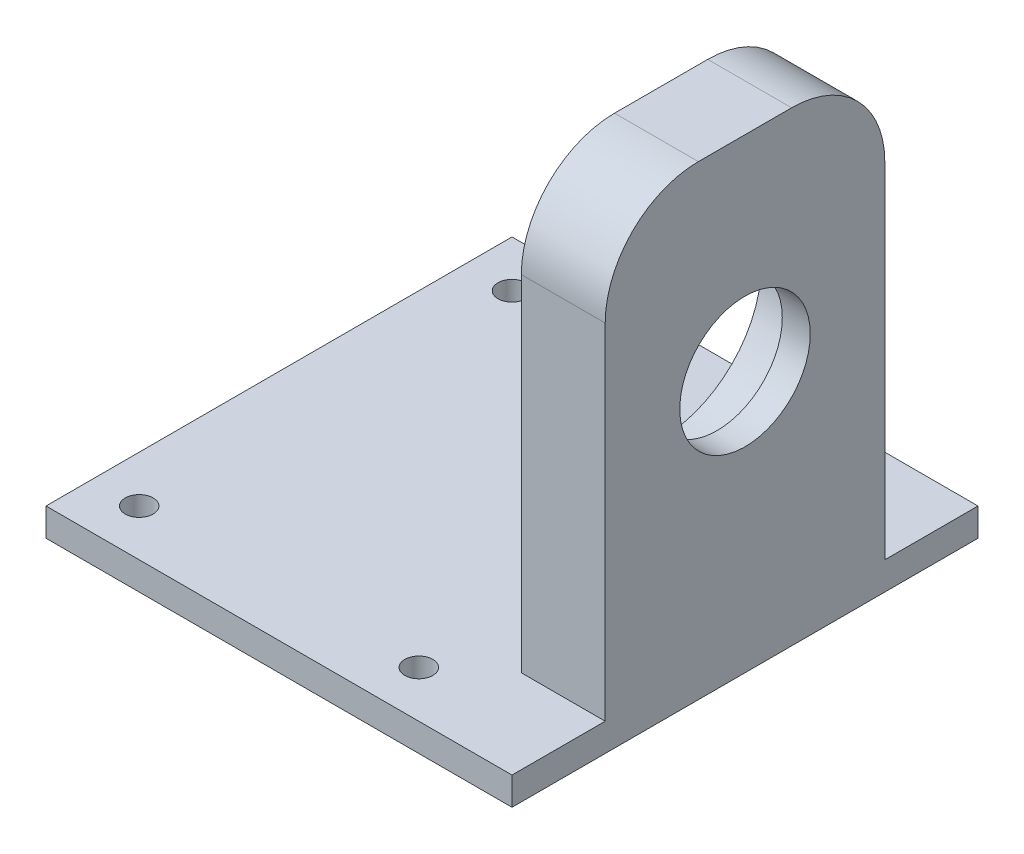
ISO-10303-21;
HEADER;
FILE_DESCRIPTION(('STEP AP214'),'2;1');
FILE_NAME('part.step','',(''),(''),'','','');
FILE_SCHEMA(('AUTOMOTIVE_DESIGN { 1 0 10303 214 1 1 1 1 }'));
ENDSEC;
DATA;
#1=APPLICATION_CONTEXT('core data for automotive mechanical design processes');
#2=APPLICATION_PROTOCOL_DEFINITION('international standard','automotive_design',2000,#1);
#3=PRODUCT_CONTEXT('',#1,'mechanical');
#4=PRODUCT('Part','Part','',(#3));
#5=PRODUCT_RELATED_PRODUCT_CATEGORY('part','',(#4));
#6=PRODUCT_DEFINITION_FORMATION('','',#4);
#7=PRODUCT_DEFINITION_CONTEXT('part definition',#1,'design');
#8=PRODUCT_DEFINITION('design','',#6,#7);
#9=PRODUCT_DEFINITION_SHAPE('','',#8);
#10=(LENGTH_UNIT() NAMED_UNIT(*) SI_UNIT(.MILLI.,.METRE.));
#11=(NAMED_UNIT(*) PLANE_ANGLE_UNIT() SI_UNIT($,.RADIAN.));
#12=(NAMED_UNIT(*) SI_UNIT($,.STERADIAN.) SOLID_ANGLE_UNIT());
#13=UNCERTAINTY_MEASURE_WITH_UNIT(LENGTH_MEASURE(1.E-05),#10,'distance_accuracy_value','');
#14=(GEOMETRIC_REPRESENTATION_CONTEXT(3) GLOBAL_UNCERTAINTY_ASSIGNED_CONTEXT((#13)) GLOBAL_UNIT_ASSIGNED_CONTEXT((#10,
#11,#12)) REPRESENTATION_CONTEXT('',''));
#15=CARTESIAN_POINT('',(0.,0.,0.));
#16=DIRECTION('',(0.,0.,1.));
#17=DIRECTION('',(1.,0.,0.));
#18=AXIS2_PLACEMENT_3D('',#15,#16,#17);
#19=CARTESIAN_POINT('',(0.,3.,0.));
#20=DIRECTION('',(0.,-1.,0.));
#21=DIRECTION('',(0.,0.,-1.));
#22=AXIS2_PLACEMENT_3D('',#19,#20,#21);
#23=PLANE('',#22);
#24=CARTESIAN_POINT('',(5.,3.,-45.));
#25=DIRECTION('',(0.,1.,0.));
#26=DIRECTION('',(0.,0.,1.));
#27=AXIS2_PLACEMENT_3D('',#24,#25,#26);
#28=CIRCLE('',#27,1.5);
#29=CARTESIAN_POINT('',(5.,3.,-43.5));
#30=VERTEX_POINT('',#29);
#31=EDGE_CURVE('E287',#30,#30,#28,.T.);
#32=ORIENTED_EDGE('',*,*,#31,.F.);
#33=EDGE_LOOP('',(#32));
#34=FACE_BOUND('',#33,.T.);
#35=CARTESIAN_POINT('',(5.,3.,-5.));
#36=DIRECTION('',(0.,1.,0.));
#37=DIRECTION('',(0.,0.,1.));
#38=AXIS2_PLACEMENT_3D('',#35,#36,#37);
#39=CIRCLE('',#38,1.5);
#40=CARTESIAN_POINT('',(5.,3.,-3.5));
#41=VERTEX_POINT('',#40);
#42=EDGE_CURVE('E299',#41,#41,#39,.T.);
#43=ORIENTED_EDGE('',*,*,#42,.F.);
#44=EDGE_LOOP('',(#43));
#45=FACE_BOUND('',#44,.T.);
#46=CARTESIAN_POINT('',(35.,3.,-5.));
#47=DIRECTION('',(0.,1.,0.));
#48=DIRECTION('',(0.,0.,1.));
#49=AXIS2_PLACEMENT_3D('',#46,#47,#48);
#50=CIRCLE('',#49,1.5);
#51=CARTESIAN_POINT('',(35.,3.,-3.49999999999999));
#52=VERTEX_POINT('',#51);
#53=EDGE_CURVE('E293',#52,#52,#50,.T.);
#54=ORIENTED_EDGE('',*,*,#53,.F.);
#55=EDGE_LOOP('',(#54));
#56=FACE_BOUND('',#55,.T.);
#57=CARTESIAN_POINT('',(35.,3.,-45.));
#58=DIRECTION('',(0.,1.,0.));
#59=DIRECTION('',(0.,0.,1.));
#60=AXIS2_PLACEMENT_3D('',#57,#58,#59);
#61=CIRCLE('',#60,1.5);
#62=CARTESIAN_POINT('',(35.,3.,-43.5));
#63=VERTEX_POINT('',#62);
#64=EDGE_CURVE('E283',#63,#63,#61,.T.);
#65=ORIENTED_EDGE('',*,*,#64,.F.);
#66=EDGE_LOOP('',(#65));
#67=FACE_BOUND('',#66,.T.);
#68=DIRECTION('',(1.,0.,0.));
#69=VECTOR('',#68,1.);
#70=CARTESIAN_POINT('',(41.,3.,-10.));
#71=LINE('',#70,#69);
#72=CARTESIAN_POINT('',(41.,3.,-10.));
#73=VERTEX_POINT('',#72);
#74=CARTESIAN_POINT('',(50.,3.,-10.));
#75=VERTEX_POINT('',#74);
#76=EDGE_CURVE('E124',#73,#75,#71,.T.);
#77=ORIENTED_EDGE('',*,*,#76,.F.);
#78=DIRECTION('',(0.,0.,1.));
#79=VECTOR('',#78,1.);
#80=CARTESIAN_POINT('',(41.,3.,-40.));
#81=LINE('',#80,#79);
#82=CARTESIAN_POINT('',(41.,3.,-40.));
#83=VERTEX_POINT('',#82);
#84=EDGE_CURVE('E110',#83,#73,#81,.T.);
#85=ORIENTED_EDGE('',*,*,#84,.F.);
#86=DIRECTION('',(-1.,0.,0.));
#87=VECTOR('',#86,1.);
#88=CARTESIAN_POINT('',(50.,3.,-40.));
#89=LINE('',#88,#87);
#90=CARTESIAN_POINT('',(50.,3.,-40.));
#91=VERTEX_POINT('',#90);
#92=EDGE_CURVE('E120',#91,#83,#89,.T.);
#93=ORIENTED_EDGE('',*,*,#92,.F.);
#94=DIRECTION('',(0.,0.,-1.));
#95=VECTOR('',#94,1.);
#96=CARTESIAN_POINT('',(50.,3.,0.));
#97=LINE('',#96,#95);
#98=CARTESIAN_POINT('',(50.,3.,-50.));
#99=VERTEX_POINT('',#98);
#100=EDGE_CURVE('E150',#91,#99,#97,.T.);
#101=ORIENTED_EDGE('',*,*,#100,.T.);
#102=DIRECTION('',(-1.,0.,0.));
#103=VECTOR('',#102,1.);
#104=CARTESIAN_POINT('',(0.,3.,-50.));
#105=LINE('',#104,#103);
#106=CARTESIAN_POINT('',(0.,3.,-50.));
#107=VERTEX_POINT('',#106);
#108=EDGE_CURVE('E153',#99,#107,#105,.T.);
#109=ORIENTED_EDGE('',*,*,#108,.T.);
#110=DIRECTION('',(0.,0.,1.));
#111=VECTOR('',#110,1.);
#112=CARTESIAN_POINT('',(0.,3.,0.));
#113=LINE('',#112,#111);
#114=CARTESIAN_POINT('',(0.,3.,0.));
#115=VERTEX_POINT('',#114);
#116=EDGE_CURVE('E144',#107,#115,#113,.T.);
#117=ORIENTED_EDGE('',*,*,#116,.T.);
#118=DIRECTION('',(1.,0.,0.));
#119=VECTOR('',#118,1.);
#120=CARTESIAN_POINT('',(0.,3.,0.));
#121=LINE('',#120,#119);
#122=CARTESIAN_POINT('',(50.,3.,0.));
#123=VERTEX_POINT('',#122);
#124=EDGE_CURVE('E147',#115,#123,#121,.T.);
#125=ORIENTED_EDGE('',*,*,#124,.T.);
#126=EDGE_CURVE('E151',#123,#75,#97,.T.);
#127=ORIENTED_EDGE('',*,*,#126,.T.);
#128=EDGE_LOOP('',(#77,#85,#93,#101,#109,#117,#125,#127));
#129=FACE_BOUND('',#128,.T.);
#130=ADVANCED_FACE('F32',(#34,#45,#56,#67,#129),#23,.F.);
#131=CARTESIAN_POINT('',(0.,3.,0.));
#132=DIRECTION('',(1.,0.,0.));
#133=DIRECTION('',(0.,0.,-1.));
#134=AXIS2_PLACEMENT_3D('',#131,#132,#133);
#135=PLANE('',#134);
#136=DIRECTION('',(0.,0.,1.));
#137=VECTOR('',#136,1.);
#138=CARTESIAN_POINT('',(0.,0.,0.));
#139=LINE('',#138,#137);
#140=CARTESIAN_POINT('',(0.,0.,-50.));
#141=VERTEX_POINT('',#140);
#142=CARTESIAN_POINT('',(0.,0.,0.));
#143=VERTEX_POINT('',#142);
#144=EDGE_CURVE('E143',#141,#143,#139,.T.);
#145=ORIENTED_EDGE('',*,*,#144,.T.);
#146=DIRECTION('',(0.,-1.,0.));
#147=VECTOR('',#146,1.);
#148=CARTESIAN_POINT('',(0.,3.,0.));
#149=LINE('',#148,#147);
#150=EDGE_CURVE('E171',#115,#143,#149,.T.);
#151=ORIENTED_EDGE('',*,*,#150,.F.);
#152=ORIENTED_EDGE('',*,*,#116,.F.);
#153=DIRECTION('',(0.,-1.,0.));
#154=VECTOR('',#153,1.);
#155=CARTESIAN_POINT('',(0.,3.,-50.));
#156=LINE('',#155,#154);
#157=EDGE_CURVE('E155',#107,#141,#156,.T.);
#158=ORIENTED_EDGE('',*,*,#157,.T.);
#159=EDGE_LOOP('',(#145,#151,#152,#158));
#160=FACE_BOUND('',#159,.T.);
#161=ADVANCED_FACE('F210',(#160),#135,.F.);
#162=CARTESIAN_POINT('',(0.,3.,0.));
#163=DIRECTION('',(0.,0.,-1.));
#164=DIRECTION('',(-1.,0.,0.));
#165=AXIS2_PLACEMENT_3D('',#162,#163,#164);
#166=PLANE('',#165);
#167=DIRECTION('',(1.,0.,0.));
#168=VECTOR('',#167,1.);
#169=CARTESIAN_POINT('',(0.,0.,0.));
#170=LINE('',#169,#168);
#171=CARTESIAN_POINT('',(50.,0.,0.));
#172=VERTEX_POINT('',#171);
#173=EDGE_CURVE('E158',#143,#172,#170,.T.);
#174=ORIENTED_EDGE('',*,*,#173,.T.);
#175=DIRECTION('',(0.,-1.,0.));
#176=VECTOR('',#175,1.);
#177=CARTESIAN_POINT('',(50.,3.,0.));
#178=LINE('',#177,#176);
#179=EDGE_CURVE('E168',#123,#172,#178,.T.);
#180=ORIENTED_EDGE('',*,*,#179,.F.);
#181=ORIENTED_EDGE('',*,*,#124,.F.);
#182=ORIENTED_EDGE('',*,*,#150,.T.);
#183=EDGE_LOOP('',(#174,#180,#181,#182));
#184=FACE_BOUND('',#183,.T.);
#185=ADVANCED_FACE('F216',(#184),#166,.F.);
#186=CARTESIAN_POINT('',(50.,3.,0.));
#187=DIRECTION('',(-1.,0.,0.));
#188=DIRECTION('',(0.,0.,1.));
#189=AXIS2_PLACEMENT_3D('',#186,#187,#188);
#190=PLANE('',#189);
#191=CARTESIAN_POINT('',(50.,28.,-25.));
#192=DIRECTION('',(1.,0.,0.));
#193=DIRECTION('',(0.,0.,-1.));
#194=AXIS2_PLACEMENT_3D('',#191,#192,#193);
#195=CIRCLE('',#194,7.);
#196=CARTESIAN_POINT('',(50.,28.,-32.));
#197=VERTEX_POINT('',#196);
#198=EDGE_CURVE('E128',#197,#197,#195,.T.);
#199=ORIENTED_EDGE('',*,*,#198,.F.);
#200=EDGE_LOOP('',(#199));
#201=FACE_BOUND('',#200,.T.);
#202=DIRECTION('',(0.,0.,-1.));
#203=VECTOR('',#202,1.);
#204=CARTESIAN_POINT('',(50.,50.,-40.));
#205=LINE('',#204,#203);
#206=CARTESIAN_POINT('',(50.,50.,-20.));
#207=VERTEX_POINT('',#206);
#208=CARTESIAN_POINT('',(50.,50.,-30.));
#209=VERTEX_POINT('',#208);
#210=EDGE_CURVE('E138',#207,#209,#205,.T.);
#211=ORIENTED_EDGE('',*,*,#210,.F.);
#212=CARTESIAN_POINT('',(50.,40.,-20.));
#213=DIRECTION('',(-1.,0.,0.));
#214=DIRECTION('',(0.,0.,1.));
#215=AXIS2_PLACEMENT_3D('',#212,#213,#214);
#216=CIRCLE('',#215,10.);
#217=CARTESIAN_POINT('',(50.,40.,-10.));
#218=VERTEX_POINT('',#217);
#219=EDGE_CURVE('E182',#207,#218,#216,.F.);
#220=ORIENTED_EDGE('',*,*,#219,.T.);
#221=DIRECTION('',(0.,-1.,0.));
#222=VECTOR('',#221,1.);
#223=CARTESIAN_POINT('',(50.,50.,-10.));
#224=LINE('',#223,#222);
#225=EDGE_CURVE('E139',#218,#75,#224,.T.);
#226=ORIENTED_EDGE('',*,*,#225,.T.);
#227=ORIENTED_EDGE('',*,*,#126,.F.);
#228=ORIENTED_EDGE('',*,*,#179,.T.);
#229=DIRECTION('',(0.,0.,-1.));
#230=VECTOR('',#229,1.);
#231=CARTESIAN_POINT('',(50.,0.,0.));
#232=LINE('',#231,#230);
#233=CARTESIAN_POINT('',(50.,0.,-50.));
#234=VERTEX_POINT('',#233);
#235=EDGE_CURVE('E160',#172,#234,#232,.T.);
#236=ORIENTED_EDGE('',*,*,#235,.T.);
#237=DIRECTION('',(0.,-1.,0.));
#238=VECTOR('',#237,1.);
#239=CARTESIAN_POINT('',(50.,3.,-50.));
#240=LINE('',#239,#238);
#241=EDGE_CURVE('E165',#99,#234,#240,.T.);
#242=ORIENTED_EDGE('',*,*,#241,.F.);
#243=ORIENTED_EDGE('',*,*,#100,.F.);
#244=DIRECTION('',(0.,-1.,0.));
#245=VECTOR('',#244,1.);
#246=CARTESIAN_POINT('',(50.,50.,-40.));
#247=LINE('',#246,#245);
#248=CARTESIAN_POINT('',(50.,40.,-40.));
#249=VERTEX_POINT('',#248);
#250=EDGE_CURVE('E114',#249,#91,#247,.T.);
#251=ORIENTED_EDGE('',*,*,#250,.F.);
#252=CARTESIAN_POINT('',(50.,40.,-30.));
#253=DIRECTION('',(-1.,0.,0.));
#254=DIRECTION('',(0.,0.,1.));
#255=AXIS2_PLACEMENT_3D('',#252,#253,#254);
#256=CIRCLE('',#255,10.);
#257=EDGE_CURVE('E180',#249,#209,#256,.F.);
#258=ORIENTED_EDGE('',*,*,#257,.T.);
#259=EDGE_LOOP('',(#211,#220,#226,#227,#228,#236,#242,#243,#251,#258));
#260=FACE_BOUND('',#259,.T.);
#261=ADVANCED_FACE('F196',(#201,#260),#190,.F.);
#262=CARTESIAN_POINT('',(0.,3.,-50.));
#263=DIRECTION('',(0.,0.,1.));
#264=DIRECTION('',(1.,0.,0.));
#265=AXIS2_PLACEMENT_3D('',#262,#263,#264);
#266=PLANE('',#265);
#267=DIRECTION('',(-1.,0.,0.));
#268=VECTOR('',#267,1.);
#269=CARTESIAN_POINT('',(0.,0.,-50.));
#270=LINE('',#269,#268);
#271=EDGE_CURVE('E148',#234,#141,#270,.T.);
#272=ORIENTED_EDGE('',*,*,#271,.T.);
#273=ORIENTED_EDGE('',*,*,#157,.F.);
#274=ORIENTED_EDGE('',*,*,#108,.F.);
#275=ORIENTED_EDGE('',*,*,#241,.T.);
#276=EDGE_LOOP('',(#272,#273,#274,#275));
#277=FACE_BOUND('',#276,.T.);
#278=ADVANCED_FACE('F226',(#277),#266,.F.);
#279=CARTESIAN_POINT('',(0.,0.,0.));
#280=DIRECTION('',(0.,-1.,0.));
#281=DIRECTION('',(0.,0.,-1.));
#282=AXIS2_PLACEMENT_3D('',#279,#280,#281);
#283=PLANE('',#282);
#284=CARTESIAN_POINT('',(5.,0.,-45.));
#285=DIRECTION('',(0.,-1.,0.));
#286=DIRECTION('',(0.,0.,-1.));
#287=AXIS2_PLACEMENT_3D('',#284,#285,#286);
#288=CIRCLE('',#287,1.5);
#289=CARTESIAN_POINT('',(5.,0.,-43.5));
#290=VERTEX_POINT('',#289);
#291=EDGE_CURVE('E302',#290,#290,#288,.F.);
#292=ORIENTED_EDGE('',*,*,#291,.T.);
#293=EDGE_LOOP('',(#292));
#294=FACE_BOUND('',#293,.T.);
#295=CARTESIAN_POINT('',(5.,0.,-5.));
#296=DIRECTION('',(0.,-1.,0.));
#297=DIRECTION('',(0.,0.,-1.));
#298=AXIS2_PLACEMENT_3D('',#295,#296,#297);
#299=CIRCLE('',#298,1.5);
#300=CARTESIAN_POINT('',(5.,0.,-3.5));
#301=VERTEX_POINT('',#300);
#302=EDGE_CURVE('E296',#301,#301,#299,.F.);
#303=ORIENTED_EDGE('',*,*,#302,.T.);
#304=EDGE_LOOP('',(#303));
#305=FACE_BOUND('',#304,.T.);
#306=CARTESIAN_POINT('',(35.,0.,-5.));
#307=DIRECTION('',(0.,-1.,0.));
#308=DIRECTION('',(0.,0.,-1.));
#309=AXIS2_PLACEMENT_3D('',#306,#307,#308);
#310=CIRCLE('',#309,1.5);
#311=CARTESIAN_POINT('',(35.,0.,-3.49999999999999));
#312=VERTEX_POINT('',#311);
#313=EDGE_CURVE('E290',#312,#312,#310,.F.);
#314=ORIENTED_EDGE('',*,*,#313,.T.);
#315=EDGE_LOOP('',(#314));
#316=FACE_BOUND('',#315,.T.);
#317=CARTESIAN_POINT('',(35.,0.,-45.));
#318=DIRECTION('',(0.,-1.,0.));
#319=DIRECTION('',(0.,0.,-1.));
#320=AXIS2_PLACEMENT_3D('',#317,#318,#319);
#321=CIRCLE('',#320,1.5);
#322=CARTESIAN_POINT('',(35.,0.,-43.5));
#323=VERTEX_POINT('',#322);
#324=EDGE_CURVE('E284',#323,#323,#321,.F.);
#325=ORIENTED_EDGE('',*,*,#324,.T.);
#326=EDGE_LOOP('',(#325));
#327=FACE_BOUND('',#326,.T.);
#328=ORIENTED_EDGE('',*,*,#144,.F.);
#329=ORIENTED_EDGE('',*,*,#271,.F.);
#330=ORIENTED_EDGE('',*,*,#235,.F.);
#331=ORIENTED_EDGE('',*,*,#173,.F.);
#332=EDGE_LOOP('',(#328,#329,#330,#331));
#333=FACE_BOUND('',#332,.T.);
#334=ADVANCED_FACE('F223',(#294,#305,#316,#327,#333),#283,.T.);
#335=CARTESIAN_POINT('',(50.,50.,-40.));
#336=DIRECTION('',(0.,0.,1.));
#337=DIRECTION('',(1.,0.,0.));
#338=AXIS2_PLACEMENT_3D('',#335,#336,#337);
#339=PLANE('',#338);
#340=DIRECTION('',(0.,-1.,0.));
#341=VECTOR('',#340,1.);
#342=CARTESIAN_POINT('',(41.,50.,-40.));
#343=LINE('',#342,#341);
#344=CARTESIAN_POINT('',(41.,40.,-40.));
#345=VERTEX_POINT('',#344);
#346=EDGE_CURVE('E107',#345,#83,#343,.T.);
#347=ORIENTED_EDGE('',*,*,#346,.F.);
#348=DIRECTION('',(-1.,0.,0.));
#349=VECTOR('',#348,1.);
#350=CARTESIAN_POINT('',(50.,40.,-40.));
#351=LINE('',#350,#349);
#352=EDGE_CURVE('E11',#345,#249,#351,.F.);
#353=ORIENTED_EDGE('',*,*,#352,.T.);
#354=ORIENTED_EDGE('',*,*,#250,.T.);
#355=ORIENTED_EDGE('',*,*,#92,.T.);
#356=EDGE_LOOP('',(#347,#353,#354,#355));
#357=FACE_BOUND('',#356,.T.);
#358=ADVANCED_FACE('F126',(#357),#339,.F.);
#359=CARTESIAN_POINT('',(41.,50.,-40.));
#360=DIRECTION('',(1.,0.,0.));
#361=DIRECTION('',(0.,0.,-1.));
#362=AXIS2_PLACEMENT_3D('',#359,#360,#361);
#363=PLANE('',#362);
#364=CARTESIAN_POINT('',(41.,28.,-25.));
#365=DIRECTION('',(1.,0.,0.));
#366=DIRECTION('',(0.,0.,-1.));
#367=AXIS2_PLACEMENT_3D('',#364,#365,#366);
#368=CIRCLE('',#367,10.75);
#369=CARTESIAN_POINT('',(41.,28.,-35.75));
#370=VERTEX_POINT('',#369);
#371=EDGE_CURVE('E265',#370,#370,#368,.F.);
#372=ORIENTED_EDGE('',*,*,#371,.F.);
#373=EDGE_LOOP('',(#372));
#374=FACE_BOUND('',#373,.T.);
#375=DIRECTION('',(0.,-1.,0.));
#376=VECTOR('',#375,1.);
#377=CARTESIAN_POINT('',(41.,50.,-10.));
#378=LINE('',#377,#376);
#379=CARTESIAN_POINT('',(41.,40.,-10.));
#380=VERTEX_POINT('',#379);
#381=EDGE_CURVE('E115',#380,#73,#378,.T.);
#382=ORIENTED_EDGE('',*,*,#381,.F.);
#383=CARTESIAN_POINT('',(41.,40.,-20.));
#384=DIRECTION('',(1.,0.,0.));
#385=DIRECTION('',(0.,0.,-1.));
#386=AXIS2_PLACEMENT_3D('',#383,#384,#385);
#387=CIRCLE('',#386,10.);
#388=CARTESIAN_POINT('',(41.,50.,-20.));
#389=VERTEX_POINT('',#388);
#390=EDGE_CURVE('E40',#380,#389,#387,.F.);
#391=ORIENTED_EDGE('',*,*,#390,.T.);
#392=DIRECTION('',(0.,0.,1.));
#393=VECTOR('',#392,1.);
#394=CARTESIAN_POINT('',(41.,50.,-40.));
#395=LINE('',#394,#393);
#396=CARTESIAN_POINT('',(41.,50.,-30.));
#397=VERTEX_POINT('',#396);
#398=EDGE_CURVE('E134',#397,#389,#395,.T.);
#399=ORIENTED_EDGE('',*,*,#398,.F.);
#400=CARTESIAN_POINT('',(41.,40.,-30.));
#401=DIRECTION('',(1.,0.,0.));
#402=DIRECTION('',(0.,0.,-1.));
#403=AXIS2_PLACEMENT_3D('',#400,#401,#402);
#404=CIRCLE('',#403,10.);
#405=EDGE_CURVE('E47',#397,#345,#404,.F.);
#406=ORIENTED_EDGE('',*,*,#405,.T.);
#407=ORIENTED_EDGE('',*,*,#346,.T.);
#408=ORIENTED_EDGE('',*,*,#84,.T.);
#409=EDGE_LOOP('',(#382,#391,#399,#406,#407,#408));
#410=FACE_BOUND('',#409,.T.);
#411=ADVANCED_FACE('F109',(#374,#410),#363,.F.);
#412=CARTESIAN_POINT('',(41.,50.,-10.));
#413=DIRECTION('',(0.,0.,-1.));
#414=DIRECTION('',(-1.,0.,0.));
#415=AXIS2_PLACEMENT_3D('',#412,#413,#414);
#416=PLANE('',#415);
#417=ORIENTED_EDGE('',*,*,#225,.F.);
#418=DIRECTION('',(1.,0.,0.));
#419=VECTOR('',#418,1.);
#420=CARTESIAN_POINT('',(41.,40.,-10.));
#421=LINE('',#420,#419);
#422=EDGE_CURVE('E55',#218,#380,#421,.F.);
#423=ORIENTED_EDGE('',*,*,#422,.T.);
#424=ORIENTED_EDGE('',*,*,#381,.T.);
#425=ORIENTED_EDGE('',*,*,#76,.T.);
#426=EDGE_LOOP('',(#417,#423,#424,#425));
#427=FACE_BOUND('',#426,.T.);
#428=ADVANCED_FACE('F198',(#427),#416,.F.);
#429=CARTESIAN_POINT('',(0.,50.,0.));
#430=DIRECTION('',(0.,1.,0.));
#431=DIRECTION('',(0.,0.,1.));
#432=AXIS2_PLACEMENT_3D('',#429,#430,#431);
#433=PLANE('',#432);
#434=ORIENTED_EDGE('',*,*,#398,.T.);
#435=DIRECTION('',(1.,0.,0.));
#436=VECTOR('',#435,1.);
#437=CARTESIAN_POINT('',(50.,50.,-20.));
#438=LINE('',#437,#436);
#439=EDGE_CURVE('E177',#389,#207,#438,.T.);
#440=ORIENTED_EDGE('',*,*,#439,.T.);
#441=ORIENTED_EDGE('',*,*,#210,.T.);
#442=DIRECTION('',(-1.,0.,0.));
#443=VECTOR('',#442,1.);
#444=CARTESIAN_POINT('',(41.,50.,-30.));
#445=LINE('',#444,#443);
#446=EDGE_CURVE('E174',#209,#397,#445,.T.);
#447=ORIENTED_EDGE('',*,*,#446,.T.);
#448=EDGE_LOOP('',(#434,#440,#441,#447));
#449=FACE_BOUND('',#448,.T.);
#450=ADVANCED_FACE('F190',(#449),#433,.T.);
#451=CARTESIAN_POINT('',(47.,28.,-25.));
#452=DIRECTION('',(1.,0.,0.));
#453=DIRECTION('',(0.,0.,-1.));
#454=AXIS2_PLACEMENT_3D('',#451,#452,#453);
#455=CYLINDRICAL_SURFACE('',#454,7.);
#456=CARTESIAN_POINT('',(47.,28.,-25.));
#457=DIRECTION('',(1.,0.,0.));
#458=DIRECTION('',(0.,0.,-1.));
#459=AXIS2_PLACEMENT_3D('',#456,#457,#458);
#460=CIRCLE('',#459,7.);
#461=CARTESIAN_POINT('',(47.,28.,-32.));
#462=VERTEX_POINT('',#461);
#463=EDGE_CURVE('E131',#462,#462,#460,.F.);
#464=ORIENTED_EDGE('',*,*,#463,.T.);
#465=EDGE_LOOP('',(#464));
#466=FACE_BOUND('',#465,.T.);
#467=ORIENTED_EDGE('',*,*,#198,.T.);
#468=EDGE_LOOP('',(#467));
#469=FACE_BOUND('',#468,.T.);
#470=ADVANCED_FACE('F205',(#466,#469),#455,.F.);
#471=CARTESIAN_POINT('',(47.,28.,-25.));
#472=DIRECTION('',(1.,0.,0.));
#473=DIRECTION('',(0.,0.,-1.));
#474=AXIS2_PLACEMENT_3D('',#471,#472,#473);
#475=PLANE('',#474);
#476=CARTESIAN_POINT('',(47.,28.,-25.));
#477=DIRECTION('',(1.,0.,0.));
#478=DIRECTION('',(0.,0.,-1.));
#479=AXIS2_PLACEMENT_3D('',#476,#477,#478);
#480=CIRCLE('',#479,10.75);
#481=CARTESIAN_POINT('',(47.,28.,-35.75));
#482=VERTEX_POINT('',#481);
#483=EDGE_CURVE('E268',#482,#482,#480,.T.);
#484=ORIENTED_EDGE('',*,*,#483,.F.);
#485=EDGE_LOOP('',(#484));
#486=FACE_BOUND('',#485,.T.);
#487=ORIENTED_EDGE('',*,*,#463,.F.);
#488=EDGE_LOOP('',(#487));
#489=FACE_BOUND('',#488,.T.);
#490=ADVANCED_FACE('F244',(#486,#489),#475,.F.);
#491=CARTESIAN_POINT('',(-0.001000000000001,28.,-25.));
#492=DIRECTION('',(1.,0.,0.));
#493=DIRECTION('',(0.,0.,-1.));
#494=AXIS2_PLACEMENT_3D('',#491,#492,#493);
#495=CYLINDRICAL_SURFACE('',#494,10.75);
#496=ORIENTED_EDGE('',*,*,#483,.T.);
#497=EDGE_LOOP('',(#496));
#498=FACE_BOUND('',#497,.T.);
#499=ORIENTED_EDGE('',*,*,#371,.T.);
#500=EDGE_LOOP('',(#499));
#501=FACE_BOUND('',#500,.T.);
#502=ADVANCED_FACE('F237',(#498,#501),#495,.F.);
#503=CARTESIAN_POINT('',(0.,40.,-20.));
#504=DIRECTION('',(-1.,0.,0.));
#505=DIRECTION('',(0.,0.,1.));
#506=AXIS2_PLACEMENT_3D('',#503,#504,#505);
#507=CYLINDRICAL_SURFACE('',#506,10.);
#508=ORIENTED_EDGE('',*,*,#390,.F.);
#509=ORIENTED_EDGE('',*,*,#422,.F.);
#510=ORIENTED_EDGE('',*,*,#219,.F.);
#511=ORIENTED_EDGE('',*,*,#439,.F.);
#512=EDGE_LOOP('',(#508,#509,#510,#511));
#513=FACE_BOUND('',#512,.T.);
#514=ADVANCED_FACE('F194',(#513),#507,.T.);
#515=CARTESIAN_POINT('',(0.,40.,-30.));
#516=DIRECTION('',(1.,0.,0.));
#517=DIRECTION('',(0.,0.,-1.));
#518=AXIS2_PLACEMENT_3D('',#515,#516,#517);
#519=CYLINDRICAL_SURFACE('',#518,10.);
#520=ORIENTED_EDGE('',*,*,#257,.F.);
#521=ORIENTED_EDGE('',*,*,#352,.F.);
#522=ORIENTED_EDGE('',*,*,#405,.F.);
#523=ORIENTED_EDGE('',*,*,#446,.F.);
#524=EDGE_LOOP('',(#520,#521,#522,#523));
#525=FACE_BOUND('',#524,.T.);
#526=ADVANCED_FACE('F34',(#525),#519,.T.);
#527=CARTESIAN_POINT('',(35.,-0.00100000000000013,-45.));
#528=DIRECTION('',(0.,1.,0.));
#529=DIRECTION('',(0.,0.,1.));
#530=AXIS2_PLACEMENT_3D('',#527,#528,#529);
#531=CYLINDRICAL_SURFACE('',#530,1.5);
#532=CARTESIAN_POINT('',(35.,0.,-43.5));
#533=CARTESIAN_POINT('',(35.,0.03125,-43.5));
#534=CARTESIAN_POINT('',(35.,0.0625,-43.5));
#535=CARTESIAN_POINT('',(35.,0.125,-43.5));
#536=CARTESIAN_POINT('',(35.,0.15625,-43.5));
#537=CARTESIAN_POINT('',(35.,0.21875,-43.5));
#538=CARTESIAN_POINT('',(35.,0.25,-43.5));
#539=CARTESIAN_POINT('',(35.,0.3125,-43.5));
#540=CARTESIAN_POINT('',(35.,0.34375,-43.5));
#541=CARTESIAN_POINT('',(35.,0.40625,-43.5));
#542=CARTESIAN_POINT('',(35.,0.4375,-43.5));
#543=CARTESIAN_POINT('',(35.,0.5,-43.5));
#544=CARTESIAN_POINT('',(35.,0.53125,-43.5));
#545=CARTESIAN_POINT('',(35.,0.59375,-43.5));
#546=CARTESIAN_POINT('',(35.,0.625,-43.5));
#547=CARTESIAN_POINT('',(35.,0.6875,-43.5));
#548=CARTESIAN_POINT('',(35.,0.71875,-43.5));
#549=CARTESIAN_POINT('',(35.,0.78125,-43.5));
#550=CARTESIAN_POINT('',(35.,0.8125,-43.5));
#551=CARTESIAN_POINT('',(35.,0.875,-43.5));
#552=CARTESIAN_POINT('',(35.,0.90625,-43.5));
#553=CARTESIAN_POINT('',(35.,0.96875,-43.5));
#554=CARTESIAN_POINT('',(35.,1.,-43.5));
#555=CARTESIAN_POINT('',(35.,1.0625,-43.5));
#556=CARTESIAN_POINT('',(35.,1.09375,-43.5));
#557=CARTESIAN_POINT('',(35.,1.15625,-43.5));
#558=CARTESIAN_POINT('',(35.,1.1875,-43.5));
#559=CARTESIAN_POINT('',(35.,1.25,-43.5));
#560=CARTESIAN_POINT('',(35.,1.28125,-43.5));
#561=CARTESIAN_POINT('',(35.,1.34375,-43.5));
#562=CARTESIAN_POINT('',(35.,1.375,-43.5));
#563=CARTESIAN_POINT('',(35.,1.4375,-43.5));
#564=CARTESIAN_POINT('',(35.,1.46875,-43.5));
#565=CARTESIAN_POINT('',(35.,1.53125,-43.5));
#566=CARTESIAN_POINT('',(35.,1.5625,-43.5));
#567=CARTESIAN_POINT('',(35.,1.625,-43.5));
#568=CARTESIAN_POINT('',(35.,1.65625,-43.5));
#569=CARTESIAN_POINT('',(35.,1.71875,-43.5));
#570=CARTESIAN_POINT('',(35.,1.75,-43.5));
#571=CARTESIAN_POINT('',(35.,1.8125,-43.5));
#572=CARTESIAN_POINT('',(35.,1.84375,-43.5));
#573=CARTESIAN_POINT('',(35.,1.90625,-43.5));
#574=CARTESIAN_POINT('',(35.,1.9375,-43.5));
#575=CARTESIAN_POINT('',(35.,2.,-43.5));
#576=CARTESIAN_POINT('',(35.,2.03125,-43.5));
#577=CARTESIAN_POINT('',(35.,2.09375,-43.5));
#578=CARTESIAN_POINT('',(35.,2.125,-43.5));
#579=CARTESIAN_POINT('',(35.,2.1875,-43.5));
#580=CARTESIAN_POINT('',(35.,2.21875,-43.5));
#581=CARTESIAN_POINT('',(35.,2.28125,-43.5));
#582=CARTESIAN_POINT('',(35.,2.3125,-43.5));
#583=CARTESIAN_POINT('',(35.,2.375,-43.5));
#584=CARTESIAN_POINT('',(35.,2.40625,-43.5));
#585=CARTESIAN_POINT('',(35.,2.46875,-43.5));
#586=CARTESIAN_POINT('',(35.,2.5,-43.5));
#587=CARTESIAN_POINT('',(35.,2.5625,-43.5));
#588=CARTESIAN_POINT('',(35.,2.59375,-43.5));
#589=CARTESIAN_POINT('',(35.,2.65625,-43.5));
#590=CARTESIAN_POINT('',(35.,2.6875,-43.5));
#591=CARTESIAN_POINT('',(35.,2.75,-43.5));
#592=CARTESIAN_POINT('',(35.,2.78125,-43.5));
#593=CARTESIAN_POINT('',(35.,2.84375,-43.5));
#594=CARTESIAN_POINT('',(35.,2.875,-43.5));
#595=CARTESIAN_POINT('',(35.,2.9375,-43.5));
#596=CARTESIAN_POINT('',(35.,2.96875,-43.5));
#597=CARTESIAN_POINT('',(35.,3.,-43.5));
#598=B_SPLINE_CURVE_WITH_KNOTS('',3,(#532,#533,#534,#535,#536,#537,#538,#539,#540,#541,#542,
#543,#544,#545,#546,#547,#548,#549,#550,#551,#552,#553,#554,#555,#556,#557,#558,#559,#560,#561,
#562,#563,#564,#565,#566,#567,#568,#569,#570,#571,#572,#573,#574,#575,#576,#577,#578,#579,#580,
#581,#582,#583,#584,#585,#586,#587,#588,#589,#590,#591,#592,#593,#594,#595,#596,#597),
.UNSPECIFIED.,.F.,.F.,(4,2,2,2,2,2,2,2,2,2,2,2,2,2,2,2,2,2,2,2,2,2,2,2,2,2,2,2,2,2,2,2,4),(0.,
0.09375,0.1875,0.28125,0.375,0.46875,0.5625,0.65625,0.75,0.84375,0.9375,1.03125,1.125,1.21875,
1.3125,1.40625,1.5,1.59375,1.6875,1.78125,1.875,1.96875,2.0625,2.15625,2.25,2.34375,2.4375,
2.53125,2.625,2.71875,2.8125,2.90625,3.),.UNSPECIFIED.);
#599=EDGE_CURVE('BSEAM242',#323,#63,#598,.T.);
#600=ORIENTED_EDGE('',*,*,#324,.F.);
#601=ORIENTED_EDGE('',*,*,#64,.T.);
#602=ORIENTED_EDGE('',*,*,#599,.T.);
#603=ORIENTED_EDGE('',*,*,#599,.F.);
#604=EDGE_LOOP('',(#600,#602,#601,#603));
#605=FACE_BOUND('',#604,.T.);
#606=ADVANCED_FACE('F242',(#605),#531,.F.);
#607=CARTESIAN_POINT('',(35.,-0.00100000000000013,-5.));
#608=DIRECTION('',(0.,1.,0.));
#609=DIRECTION('',(0.,0.,1.));
#610=AXIS2_PLACEMENT_3D('',#607,#608,#609);
#611=CYLINDRICAL_SURFACE('',#610,1.5);
#612=CARTESIAN_POINT('',(35.,0.,-3.49999999999999));
#613=CARTESIAN_POINT('',(35.,0.03125,-3.49999999999999));
#614=CARTESIAN_POINT('',(35.,0.0625,-3.49999999999999));
#615=CARTESIAN_POINT('',(35.,0.125,-3.49999999999999));
#616=CARTESIAN_POINT('',(35.,0.15625,-3.49999999999999));
#617=CARTESIAN_POINT('',(35.,0.21875,-3.49999999999999));
#618=CARTESIAN_POINT('',(35.,0.25,-3.49999999999999));
#619=CARTESIAN_POINT('',(35.,0.3125,-3.49999999999999));
#620=CARTESIAN_POINT('',(35.,0.34375,-3.49999999999999));
#621=CARTESIAN_POINT('',(35.,0.40625,-3.49999999999999));
#622=CARTESIAN_POINT('',(35.,0.4375,-3.49999999999999));
#623=CARTESIAN_POINT('',(35.,0.5,-3.49999999999999));
#624=CARTESIAN_POINT('',(35.,0.53125,-3.49999999999999));
#625=CARTESIAN_POINT('',(35.,0.59375,-3.49999999999999));
#626=CARTESIAN_POINT('',(35.,0.625,-3.49999999999999));
#627=CARTESIAN_POINT('',(35.,0.6875,-3.49999999999999));
#628=CARTESIAN_POINT('',(35.,0.71875,-3.49999999999999));
#629=CARTESIAN_POINT('',(35.,0.78125,-3.49999999999999));
#630=CARTESIAN_POINT('',(35.,0.8125,-3.49999999999999));
#631=CARTESIAN_POINT('',(35.,0.875,-3.49999999999999));
#632=CARTESIAN_POINT('',(35.,0.90625,-3.49999999999999));
#633=CARTESIAN_POINT('',(35.,0.96875,-3.49999999999999));
#634=CARTESIAN_POINT('',(35.,1.,-3.49999999999999));
#635=CARTESIAN_POINT('',(35.,1.0625,-3.49999999999999));
#636=CARTESIAN_POINT('',(35.,1.09375,-3.49999999999999));
#637=CARTESIAN_POINT('',(35.,1.15625,-3.49999999999999));
#638=CARTESIAN_POINT('',(35.,1.1875,-3.49999999999999));
#639=CARTESIAN_POINT('',(35.,1.25,-3.49999999999999));
#640=CARTESIAN_POINT('',(35.,1.28125,-3.49999999999999));
#641=CARTESIAN_POINT('',(35.,1.34375,-3.49999999999999));
#642=CARTESIAN_POINT('',(35.,1.375,-3.49999999999999));
#643=CARTESIAN_POINT('',(35.,1.4375,-3.49999999999999));
#644=CARTESIAN_POINT('',(35.,1.46875,-3.49999999999999));
#645=CARTESIAN_POINT('',(35.,1.53125,-3.49999999999999));
#646=CARTESIAN_POINT('',(35.,1.5625,-3.49999999999999));
#647=CARTESIAN_POINT('',(35.,1.625,-3.49999999999999));
#648=CARTESIAN_POINT('',(35.,1.65625,-3.49999999999999));
#649=CARTESIAN_POINT('',(35.,1.71875,-3.49999999999999));
#650=CARTESIAN_POINT('',(35.,1.75,-3.49999999999999));
#651=CARTESIAN_POINT('',(35.,1.8125,-3.49999999999999));
#652=CARTESIAN_POINT('',(35.,1.84375,-3.49999999999999));
#653=CARTESIAN_POINT('',(35.,1.90625,-3.49999999999999));
#654=CARTESIAN_POINT('',(35.,1.9375,-3.49999999999999));
#655=CARTESIAN_POINT('',(35.,2.,-3.49999999999999));
#656=CARTESIAN_POINT('',(35.,2.03125,-3.49999999999999));
#657=CARTESIAN_POINT('',(35.,2.09375,-3.49999999999999));
#658=CARTESIAN_POINT('',(35.,2.125,-3.49999999999999));
#659=CARTESIAN_POINT('',(35.,2.1875,-3.49999999999999));
#660=CARTESIAN_POINT('',(35.,2.21875,-3.49999999999999));
#661=CARTESIAN_POINT('',(35.,2.28125,-3.49999999999999));
#662=CARTESIAN_POINT('',(35.,2.3125,-3.49999999999999));
#663=CARTESIAN_POINT('',(35.,2.375,-3.49999999999999));
#664=CARTESIAN_POINT('',(35.,2.40625,-3.49999999999999));
#665=CARTESIAN_POINT('',(35.,2.46875,-3.49999999999999));
#666=CARTESIAN_POINT('',(35.,2.5,-3.49999999999999));
#667=CARTESIAN_POINT('',(35.,2.5625,-3.49999999999999));
#668=CARTESIAN_POINT('',(35.,2.59375,-3.49999999999999));
#669=CARTESIAN_POINT('',(35.,2.65625,-3.49999999999999));
#670=CARTESIAN_POINT('',(35.,2.6875,-3.49999999999999));
#671=CARTESIAN_POINT('',(35.,2.75,-3.49999999999999));
#672=CARTESIAN_POINT('',(35.,2.78125,-3.49999999999999));
#673=CARTESIAN_POINT('',(35.,2.84375,-3.49999999999999));
#674=CARTESIAN_POINT('',(35.,2.875,-3.49999999999999));
#675=CARTESIAN_POINT('',(35.,2.9375,-3.49999999999999));
#676=CARTESIAN_POINT('',(35.,2.96875,-3.49999999999999));
#677=CARTESIAN_POINT('',(35.,3.,-3.49999999999999));
#678=B_SPLINE_CURVE_WITH_KNOTS('',3,(#612,#613,#614,#615,#616,#617,#618,#619,#620,#621,#622,
#623,#624,#625,#626,#627,#628,#629,#630,#631,#632,#633,#634,#635,#636,#637,#638,#639,#640,#641,
#642,#643,#644,#645,#646,#647,#648,#649,#650,#651,#652,#653,#654,#655,#656,#657,#658,#659,#660,
#661,#662,#663,#664,#665,#666,#667,#668,#669,#670,#671,#672,#673,#674,#675,#676,#677),
.UNSPECIFIED.,.F.,.F.,(4,2,2,2,2,2,2,2,2,2,2,2,2,2,2,2,2,2,2,2,2,2,2,2,2,2,2,2,2,2,2,2,4),(0.,
0.09375,0.1875,0.28125,0.375,0.46875,0.5625,0.65625,0.75,0.84375,0.9375,1.03125,1.125,1.21875,
1.3125,1.40625,1.5,1.59375,1.6875,1.78125,1.875,1.96875,2.0625,2.15625,2.25,2.34375,2.4375,
2.53125,2.625,2.71875,2.8125,2.90625,3.),.UNSPECIFIED.);
#679=EDGE_CURVE('BSEAM315',#312,#52,#678,.T.);
#680=ORIENTED_EDGE('',*,*,#313,.F.);
#681=ORIENTED_EDGE('',*,*,#53,.T.);
#682=ORIENTED_EDGE('',*,*,#679,.T.);
#683=ORIENTED_EDGE('',*,*,#679,.F.);
#684=EDGE_LOOP('',(#680,#682,#681,#683));
#685=FACE_BOUND('',#684,.T.);
#686=ADVANCED_FACE('F315',(#685),#611,.F.);
#687=CARTESIAN_POINT('',(5.,-0.00100000000000013,-5.));
#688=DIRECTION('',(0.,1.,0.));
#689=DIRECTION('',(0.,0.,1.));
#690=AXIS2_PLACEMENT_3D('',#687,#688,#689);
#691=CYLINDRICAL_SURFACE('',#690,1.5);
#692=CARTESIAN_POINT('',(5.,0.,-3.5));
#693=CARTESIAN_POINT('',(5.,0.03125,-3.5));
#694=CARTESIAN_POINT('',(5.,0.0625,-3.5));
#695=CARTESIAN_POINT('',(5.,0.125,-3.5));
#696=CARTESIAN_POINT('',(5.,0.15625,-3.5));
#697=CARTESIAN_POINT('',(5.,0.21875,-3.5));
#698=CARTESIAN_POINT('',(5.,0.25,-3.5));
#699=CARTESIAN_POINT('',(5.,0.3125,-3.5));
#700=CARTESIAN_POINT('',(5.,0.34375,-3.5));
#701=CARTESIAN_POINT('',(5.,0.40625,-3.5));
#702=CARTESIAN_POINT('',(5.,0.4375,-3.5));
#703=CARTESIAN_POINT('',(5.,0.5,-3.5));
#704=CARTESIAN_POINT('',(5.,0.53125,-3.5));
#705=CARTESIAN_POINT('',(5.,0.59375,-3.5));
#706=CARTESIAN_POINT('',(5.,0.625,-3.5));
#707=CARTESIAN_POINT('',(5.,0.6875,-3.5));
#708=CARTESIAN_POINT('',(5.,0.71875,-3.5));
#709=CARTESIAN_POINT('',(5.,0.78125,-3.5));
#710=CARTESIAN_POINT('',(5.,0.8125,-3.5));
#711=CARTESIAN_POINT('',(5.,0.875,-3.5));
#712=CARTESIAN_POINT('',(5.,0.90625,-3.5));
#713=CARTESIAN_POINT('',(5.,0.96875,-3.5));
#714=CARTESIAN_POINT('',(5.,1.,-3.5));
#715=CARTESIAN_POINT('',(5.,1.0625,-3.5));
#716=CARTESIAN_POINT('',(5.,1.09375,-3.5));
#717=CARTESIAN_POINT('',(5.,1.15625,-3.5));
#718=CARTESIAN_POINT('',(5.,1.1875,-3.5));
#719=CARTESIAN_POINT('',(5.,1.25,-3.5));
#720=CARTESIAN_POINT('',(5.,1.28125,-3.5));
#721=CARTESIAN_POINT('',(5.,1.34375,-3.5));
#722=CARTESIAN_POINT('',(5.,1.375,-3.5));
#723=CARTESIAN_POINT('',(5.,1.4375,-3.5));
#724=CARTESIAN_POINT('',(5.,1.46875,-3.5));
#725=CARTESIAN_POINT('',(5.,1.53125,-3.5));
#726=CARTESIAN_POINT('',(5.,1.5625,-3.5));
#727=CARTESIAN_POINT('',(5.,1.625,-3.5));
#728=CARTESIAN_POINT('',(5.,1.65625,-3.5));
#729=CARTESIAN_POINT('',(5.,1.71875,-3.5));
#730=CARTESIAN_POINT('',(5.,1.75,-3.5));
#731=CARTESIAN_POINT('',(5.,1.8125,-3.5));
#732=CARTESIAN_POINT('',(5.,1.84375,-3.5));
#733=CARTESIAN_POINT('',(5.,1.90625,-3.5));
#734=CARTESIAN_POINT('',(5.,1.9375,-3.5));
#735=CARTESIAN_POINT('',(5.,2.,-3.5));
#736=CARTESIAN_POINT('',(5.,2.03125,-3.5));
#737=CARTESIAN_POINT('',(5.,2.09375,-3.5));
#738=CARTESIAN_POINT('',(5.,2.125,-3.5));
#739=CARTESIAN_POINT('',(5.,2.1875,-3.5));
#740=CARTESIAN_POINT('',(5.,2.21875,-3.5));
#741=CARTESIAN_POINT('',(5.,2.28125,-3.5));
#742=CARTESIAN_POINT('',(5.,2.3125,-3.5));
#743=CARTESIAN_POINT('',(5.,2.375,-3.5));
#744=CARTESIAN_POINT('',(5.,2.40625,-3.5));
#745=CARTESIAN_POINT('',(5.,2.46875,-3.5));
#746=CARTESIAN_POINT('',(5.,2.5,-3.5));
#747=CARTESIAN_POINT('',(5.,2.5625,-3.5));
#748=CARTESIAN_POINT('',(5.,2.59375,-3.5));
#749=CARTESIAN_POINT('',(5.,2.65625,-3.5));
#750=CARTESIAN_POINT('',(5.,2.6875,-3.5));
#751=CARTESIAN_POINT('',(5.,2.75,-3.5));
#752=CARTESIAN_POINT('',(5.,2.78125,-3.5));
#753=CARTESIAN_POINT('',(5.,2.84375,-3.5));
#754=CARTESIAN_POINT('',(5.,2.875,-3.5));
#755=CARTESIAN_POINT('',(5.,2.9375,-3.5));
#756=CARTESIAN_POINT('',(5.,2.96875,-3.5));
#757=CARTESIAN_POINT('',(5.,3.,-3.5));
#758=B_SPLINE_CURVE_WITH_KNOTS('',3,(#692,#693,#694,#695,#696,#697,#698,#699,#700,#701,#702,
#703,#704,#705,#706,#707,#708,#709,#710,#711,#712,#713,#714,#715,#716,#717,#718,#719,#720,#721,
#722,#723,#724,#725,#726,#727,#728,#729,#730,#731,#732,#733,#734,#735,#736,#737,#738,#739,#740,
#741,#742,#743,#744,#745,#746,#747,#748,#749,#750,#751,#752,#753,#754,#755,#756,#757),
.UNSPECIFIED.,.F.,.F.,(4,2,2,2,2,2,2,2,2,2,2,2,2,2,2,2,2,2,2,2,2,2,2,2,2,2,2,2,2,2,2,2,4),(0.,
0.09375,0.1875,0.28125,0.375,0.46875,0.5625,0.65625,0.75,0.84375,0.9375,1.03125,1.125,1.21875,
1.3125,1.40625,1.5,1.59375,1.6875,1.78125,1.875,1.96875,2.0625,2.15625,2.25,2.34375,2.4375,
2.53125,2.625,2.71875,2.8125,2.90625,3.),.UNSPECIFIED.);
#759=EDGE_CURVE('BSEAM309',#301,#41,#758,.T.);
#760=ORIENTED_EDGE('',*,*,#302,.F.);
#761=ORIENTED_EDGE('',*,*,#42,.T.);
#762=ORIENTED_EDGE('',*,*,#759,.T.);
#763=ORIENTED_EDGE('',*,*,#759,.F.);
#764=EDGE_LOOP('',(#760,#762,#761,#763));
#765=FACE_BOUND('',#764,.T.);
#766=ADVANCED_FACE('F309',(#765),#691,.F.);
#767=CARTESIAN_POINT('',(5.,-0.00100000000000013,-45.));
#768=DIRECTION('',(0.,1.,0.));
#769=DIRECTION('',(0.,0.,1.));
#770=AXIS2_PLACEMENT_3D('',#767,#768,#769);
#771=CYLINDRICAL_SURFACE('',#770,1.5);
#772=CARTESIAN_POINT('',(5.,0.,-43.5));
#773=CARTESIAN_POINT('',(5.,0.03125,-43.5));
#774=CARTESIAN_POINT('',(5.,0.0625,-43.5));
#775=CARTESIAN_POINT('',(5.,0.125,-43.5));
#776=CARTESIAN_POINT('',(5.,0.15625,-43.5));
#777=CARTESIAN_POINT('',(5.,0.21875,-43.5));
#778=CARTESIAN_POINT('',(5.,0.25,-43.5));
#779=CARTESIAN_POINT('',(5.,0.3125,-43.5));
#780=CARTESIAN_POINT('',(5.,0.34375,-43.5));
#781=CARTESIAN_POINT('',(5.,0.40625,-43.5));
#782=CARTESIAN_POINT('',(5.,0.4375,-43.5));
#783=CARTESIAN_POINT('',(5.,0.5,-43.5));
#784=CARTESIAN_POINT('',(5.,0.53125,-43.5));
#785=CARTESIAN_POINT('',(5.,0.59375,-43.5));
#786=CARTESIAN_POINT('',(5.,0.625,-43.5));
#787=CARTESIAN_POINT('',(5.,0.6875,-43.5));
#788=CARTESIAN_POINT('',(5.,0.71875,-43.5));
#789=CARTESIAN_POINT('',(5.,0.78125,-43.5));
#790=CARTESIAN_POINT('',(5.,0.8125,-43.5));
#791=CARTESIAN_POINT('',(5.,0.875,-43.5));
#792=CARTESIAN_POINT('',(5.,0.90625,-43.5));
#793=CARTESIAN_POINT('',(5.,0.96875,-43.5));
#794=CARTESIAN_POINT('',(5.,1.,-43.5));
#795=CARTESIAN_POINT('',(5.,1.0625,-43.5));
#796=CARTESIAN_POINT('',(5.,1.09375,-43.5));
#797=CARTESIAN_POINT('',(5.,1.15625,-43.5));
#798=CARTESIAN_POINT('',(5.,1.1875,-43.5));
#799=CARTESIAN_POINT('',(5.,1.25,-43.5));
#800=CARTESIAN_POINT('',(5.,1.28125,-43.5));
#801=CARTESIAN_POINT('',(5.,1.34375,-43.5));
#802=CARTESIAN_POINT('',(5.,1.375,-43.5));
#803=CARTESIAN_POINT('',(5.,1.4375,-43.5));
#804=CARTESIAN_POINT('',(5.,1.46875,-43.5));
#805=CARTESIAN_POINT('',(5.,1.53125,-43.5));
#806=CARTESIAN_POINT('',(5.,1.5625,-43.5));
#807=CARTESIAN_POINT('',(5.,1.625,-43.5));
#808=CARTESIAN_POINT('',(5.,1.65625,-43.5));
#809=CARTESIAN_POINT('',(5.,1.71875,-43.5));
#810=CARTESIAN_POINT('',(5.,1.75,-43.5));
#811=CARTESIAN_POINT('',(5.,1.8125,-43.5));
#812=CARTESIAN_POINT('',(5.,1.84375,-43.5));
#813=CARTESIAN_POINT('',(5.,1.90625,-43.5));
#814=CARTESIAN_POINT('',(5.,1.9375,-43.5));
#815=CARTESIAN_POINT('',(5.,2.,-43.5));
#816=CARTESIAN_POINT('',(5.,2.03125,-43.5));
#817=CARTESIAN_POINT('',(5.,2.09375,-43.5));
#818=CARTESIAN_POINT('',(5.,2.125,-43.5));
#819=CARTESIAN_POINT('',(5.,2.1875,-43.5));
#820=CARTESIAN_POINT('',(5.,2.21875,-43.5));
#821=CARTESIAN_POINT('',(5.,2.28125,-43.5));
#822=CARTESIAN_POINT('',(5.,2.3125,-43.5));
#823=CARTESIAN_POINT('',(5.,2.375,-43.5));
#824=CARTESIAN_POINT('',(5.,2.40625,-43.5));
#825=CARTESIAN_POINT('',(5.,2.46875,-43.5));
#826=CARTESIAN_POINT('',(5.,2.5,-43.5));
#827=CARTESIAN_POINT('',(5.,2.5625,-43.5));
#828=CARTESIAN_POINT('',(5.,2.59375,-43.5));
#829=CARTESIAN_POINT('',(5.,2.65625,-43.5));
#830=CARTESIAN_POINT('',(5.,2.6875,-43.5));
#831=CARTESIAN_POINT('',(5.,2.75,-43.5));
#832=CARTESIAN_POINT('',(5.,2.78125,-43.5));
#833=CARTESIAN_POINT('',(5.,2.84375,-43.5));
#834=CARTESIAN_POINT('',(5.,2.875,-43.5));
#835=CARTESIAN_POINT('',(5.,2.9375,-43.5));
#836=CARTESIAN_POINT('',(5.,2.96875,-43.5));
#837=CARTESIAN_POINT('',(5.,3.,-43.5));
#838=B_SPLINE_CURVE_WITH_KNOTS('',3,(#772,#773,#774,#775,#776,#777,#778,#779,#780,#781,#782,
#783,#784,#785,#786,#787,#788,#789,#790,#791,#792,#793,#794,#795,#796,#797,#798,#799,#800,#801,
#802,#803,#804,#805,#806,#807,#808,#809,#810,#811,#812,#813,#814,#815,#816,#817,#818,#819,#820,
#821,#822,#823,#824,#825,#826,#827,#828,#829,#830,#831,#832,#833,#834,#835,#836,#837),
.UNSPECIFIED.,.F.,.F.,(4,2,2,2,2,2,2,2,2,2,2,2,2,2,2,2,2,2,2,2,2,2,2,2,2,2,2,2,2,2,2,2,4),(0.,
0.09375,0.1875,0.28125,0.375,0.46875,0.5625,0.65625,0.75,0.84375,0.9375,1.03125,1.125,1.21875,
1.3125,1.40625,1.5,1.59375,1.6875,1.78125,1.875,1.96875,2.0625,2.15625,2.25,2.34375,2.4375,
2.53125,2.625,2.71875,2.8125,2.90625,3.),.UNSPECIFIED.);
#839=EDGE_CURVE('BSEAM307',#290,#30,#838,.T.);
#840=ORIENTED_EDGE('',*,*,#291,.F.);
#841=ORIENTED_EDGE('',*,*,#31,.T.);
#842=ORIENTED_EDGE('',*,*,#839,.T.);
#843=ORIENTED_EDGE('',*,*,#839,.F.);
#844=EDGE_LOOP('',(#840,#842,#841,#843));
#845=FACE_BOUND('',#844,.T.);
#846=ADVANCED_FACE('F307',(#845),#771,.F.);
#847=CLOSED_SHELL('',(#130,#161,#185,#261,#278,#334,#358,#411,#428,#450,#470,#490,#502,#514,
#526,#606,#686,#766,#846));
#848=MANIFOLD_SOLID_BREP('B2',#847);
#849=ADVANCED_BREP_SHAPE_REPRESENTATION('',(#18,#848),#14);
#850=SHAPE_DEFINITION_REPRESENTATION(#9,#849);
ENDSEC;
END-ISO-10303-21;
